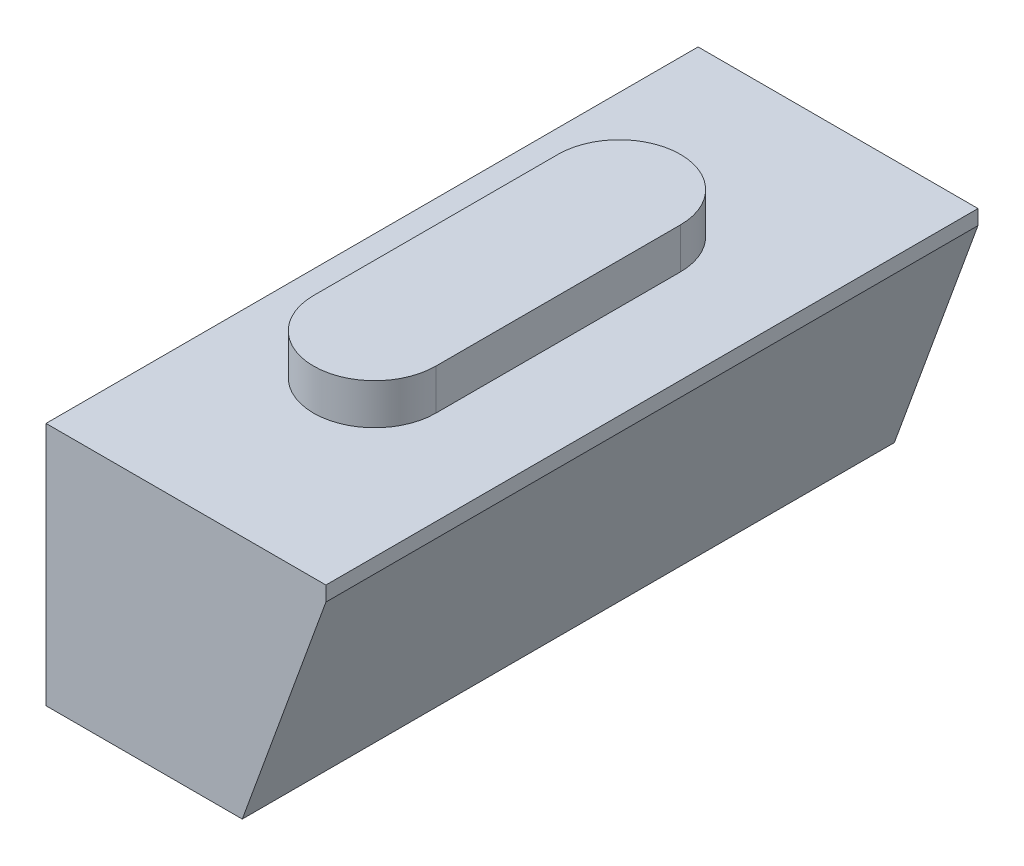
ISO-10303-21;
HEADER;
FILE_DESCRIPTION(('STEP AP214'),'2;1');
FILE_NAME('part.step','',(''),(''),'','','');
FILE_SCHEMA(('AUTOMOTIVE_DESIGN { 1 0 10303 214 1 1 1 1 }'));
ENDSEC;
DATA;
#1=APPLICATION_CONTEXT('core data for automotive mechanical design processes');
#2=APPLICATION_PROTOCOL_DEFINITION('international standard','automotive_design',2000,#1);
#3=PRODUCT_CONTEXT('',#1,'mechanical');
#4=PRODUCT('Part','Part','',(#3));
#5=PRODUCT_RELATED_PRODUCT_CATEGORY('part','',(#4));
#6=PRODUCT_DEFINITION_FORMATION('','',#4);
#7=PRODUCT_DEFINITION_CONTEXT('part definition',#1,'design');
#8=PRODUCT_DEFINITION('design','',#6,#7);
#9=PRODUCT_DEFINITION_SHAPE('','',#8);
#10=(LENGTH_UNIT() NAMED_UNIT(*) SI_UNIT(.MILLI.,.METRE.));
#11=(NAMED_UNIT(*) PLANE_ANGLE_UNIT() SI_UNIT($,.RADIAN.));
#12=(NAMED_UNIT(*) SI_UNIT($,.STERADIAN.) SOLID_ANGLE_UNIT());
#13=UNCERTAINTY_MEASURE_WITH_UNIT(LENGTH_MEASURE(1.E-05),#10,'distance_accuracy_value','');
#14=(GEOMETRIC_REPRESENTATION_CONTEXT(3) GLOBAL_UNCERTAINTY_ASSIGNED_CONTEXT((#13)) GLOBAL_UNIT_ASSIGNED_CONTEXT((#10,
#11,#12)) REPRESENTATION_CONTEXT('',''));
#15=CARTESIAN_POINT('',(0.,0.,0.));
#16=DIRECTION('',(0.,0.,1.));
#17=DIRECTION('',(1.,0.,0.));
#18=AXIS2_PLACEMENT_3D('',#15,#16,#17);
#19=CARTESIAN_POINT('',(0.,60.,160.));
#20=DIRECTION('',(0.,1.,0.));
#21=DIRECTION('',(0.,0.,1.));
#22=AXIS2_PLACEMENT_3D('',#19,#20,#21);
#23=PLANE('',#22);
#24=DIRECTION('',(0.,0.,1.));
#25=VECTOR('',#24,1.);
#26=CARTESIAN_POINT('',(68.68,60.,160.));
#27=LINE('',#26,#25);
#28=CARTESIAN_POINT('',(68.68,60.,0.));
#29=VERTEX_POINT('',#28);
#30=CARTESIAN_POINT('',(68.68,60.,160.));
#31=VERTEX_POINT('',#30);
#32=EDGE_CURVE('E101',#29,#31,#27,.T.);
#33=ORIENTED_EDGE('',*,*,#32,.F.);
#34=DIRECTION('',(1.,0.,0.));
#35=VECTOR('',#34,1.);
#36=CARTESIAN_POINT('',(0.,60.,0.));
#37=LINE('',#36,#35);
#38=CARTESIAN_POINT('',(0.,60.,0.));
#39=VERTEX_POINT('',#38);
#40=EDGE_CURVE('E137',#39,#29,#37,.T.);
#41=ORIENTED_EDGE('',*,*,#40,.F.);
#42=DIRECTION('',(0.,0.,-1.));
#43=VECTOR('',#42,1.);
#44=CARTESIAN_POINT('',(0.,60.,160.));
#45=LINE('',#44,#43);
#46=CARTESIAN_POINT('',(0.,60.,160.));
#47=VERTEX_POINT('',#46);
#48=EDGE_CURVE('E122',#47,#39,#45,.T.);
#49=ORIENTED_EDGE('',*,*,#48,.F.);
#50=DIRECTION('',(1.,0.,0.));
#51=VECTOR('',#50,1.);
#52=CARTESIAN_POINT('',(0.,60.,160.));
#53=LINE('',#52,#51);
#54=EDGE_CURVE('E116',#47,#31,#53,.T.);
#55=ORIENTED_EDGE('',*,*,#54,.T.);
#56=EDGE_LOOP('',(#33,#41,#49,#55));
#57=FACE_BOUND('',#56,.T.);
#58=DIRECTION('',(0.,0.,1.));
#59=VECTOR('',#58,1.);
#60=CARTESIAN_POINT('',(15.65,60.,50.));
#61=LINE('',#60,#59);
#62=CARTESIAN_POINT('',(15.65,60.,50.));
#63=VERTEX_POINT('',#62);
#64=CARTESIAN_POINT('',(15.65,60.,110.));
#65=VERTEX_POINT('',#64);
#66=EDGE_CURVE('E171',#63,#65,#61,.T.);
#67=ORIENTED_EDGE('',*,*,#66,.F.);
#68=CARTESIAN_POINT('',(30.65,60.,50.));
#69=DIRECTION('',(0.,1.,0.));
#70=DIRECTION('',(0.,0.,1.));
#71=AXIS2_PLACEMENT_3D('',#68,#69,#70);
#72=CIRCLE('',#71,15.);
#73=CARTESIAN_POINT('',(45.65,60.,50.));
#74=VERTEX_POINT('',#73);
#75=EDGE_CURVE('E109',#74,#63,#72,.T.);
#76=ORIENTED_EDGE('',*,*,#75,.F.);
#77=DIRECTION('',(0.,0.,-1.));
#78=VECTOR('',#77,1.);
#79=CARTESIAN_POINT('',(45.65,60.,50.));
#80=LINE('',#79,#78);
#81=CARTESIAN_POINT('',(45.65,60.,110.));
#82=VERTEX_POINT('',#81);
#83=EDGE_CURVE('E166',#82,#74,#80,.T.);
#84=ORIENTED_EDGE('',*,*,#83,.F.);
#85=CARTESIAN_POINT('',(30.65,60.,110.));
#86=DIRECTION('',(0.,1.,0.));
#87=DIRECTION('',(0.,0.,1.));
#88=AXIS2_PLACEMENT_3D('',#85,#86,#87);
#89=CIRCLE('',#88,15.);
#90=EDGE_CURVE('E169',#65,#82,#89,.T.);
#91=ORIENTED_EDGE('',*,*,#90,.F.);
#92=EDGE_LOOP('',(#67,#76,#84,#91));
#93=FACE_BOUND('',#92,.T.);
#94=ADVANCED_FACE('F32',(#57,#93),#23,.T.);
#95=CARTESIAN_POINT('',(0.,0.,160.));
#96=DIRECTION('',(0.,1.,0.));
#97=DIRECTION('',(0.,0.,1.));
#98=AXIS2_PLACEMENT_3D('',#95,#96,#97);
#99=PLANE('',#98);
#100=DIRECTION('',(1.,0.,0.));
#101=VECTOR('',#100,1.);
#102=CARTESIAN_POINT('',(0.,0.,0.));
#103=LINE('',#102,#101);
#104=CARTESIAN_POINT('',(0.,0.,0.));
#105=VERTEX_POINT('',#104);
#106=CARTESIAN_POINT('',(48.1617859440276,0.,0.));
#107=VERTEX_POINT('',#106);
#108=EDGE_CURVE('E131',#105,#107,#103,.T.);
#109=ORIENTED_EDGE('',*,*,#108,.T.);
#110=DIRECTION('',(0.,0.,-1.));
#111=VECTOR('',#110,1.);
#112=CARTESIAN_POINT('',(48.1617859440276,0.,160.));
#113=LINE('',#112,#111);
#114=CARTESIAN_POINT('',(48.1617859440276,0.,160.));
#115=VERTEX_POINT('',#114);
#116=EDGE_CURVE('E40',#115,#107,#113,.T.);
#117=ORIENTED_EDGE('',*,*,#116,.F.);
#118=DIRECTION('',(1.,0.,0.));
#119=VECTOR('',#118,1.);
#120=CARTESIAN_POINT('',(0.,0.,160.));
#121=LINE('',#120,#119);
#122=CARTESIAN_POINT('',(0.,0.,160.));
#123=VERTEX_POINT('',#122);
#124=EDGE_CURVE('E127',#123,#115,#121,.T.);
#125=ORIENTED_EDGE('',*,*,#124,.F.);
#126=DIRECTION('',(0.,0.,-1.));
#127=VECTOR('',#126,1.);
#128=CARTESIAN_POINT('',(0.,0.,160.));
#129=LINE('',#128,#127);
#130=EDGE_CURVE('E125',#123,#105,#129,.T.);
#131=ORIENTED_EDGE('',*,*,#130,.T.);
#132=EDGE_LOOP('',(#109,#117,#125,#131));
#133=FACE_BOUND('',#132,.T.);
#134=ADVANCED_FACE('F34',(#133),#99,.F.);
#135=CARTESIAN_POINT('',(70.,60.,160.));
#136=DIRECTION('',(0.939692620785907,-0.342020143325673,0.));
#137=DIRECTION('',(0.342020143325673,0.939692620785907,0.));
#138=AXIS2_PLACEMENT_3D('',#135,#136,#137);
#139=PLANE('',#138);
#140=DIRECTION('',(0.,0.,-1.));
#141=VECTOR('',#140,1.);
#142=CARTESIAN_POINT('',(68.68,56.3733298063199,160.));
#143=LINE('',#142,#141);
#144=CARTESIAN_POINT('',(68.68,56.3733298063199,160.));
#145=VERTEX_POINT('',#144);
#146=CARTESIAN_POINT('',(68.68,56.3733298063199,0.));
#147=VERTEX_POINT('',#146);
#148=EDGE_CURVE('E47',#145,#147,#143,.T.);
#149=ORIENTED_EDGE('',*,*,#148,.F.);
#150=DIRECTION('',(-0.342020143325673,-0.939692620785907,0.));
#151=VECTOR('',#150,1.);
#152=CARTESIAN_POINT('',(70.,60.,160.));
#153=LINE('',#152,#151);
#154=EDGE_CURVE('E119',#145,#115,#153,.T.);
#155=ORIENTED_EDGE('',*,*,#154,.T.);
#156=ORIENTED_EDGE('',*,*,#116,.T.);
#157=DIRECTION('',(-0.342020143325673,-0.939692620785907,0.));
#158=VECTOR('',#157,1.);
#159=CARTESIAN_POINT('',(70.,60.,0.));
#160=LINE('',#159,#158);
#161=EDGE_CURVE('E134',#147,#107,#160,.T.);
#162=ORIENTED_EDGE('',*,*,#161,.F.);
#163=EDGE_LOOP('',(#149,#155,#156,#162));
#164=FACE_BOUND('',#163,.T.);
#165=ADVANCED_FACE('F147',(#164),#139,.T.);
#166=CARTESIAN_POINT('',(0.,0.,160.));
#167=DIRECTION('',(-1.,0.,0.));
#168=DIRECTION('',(0.,0.,1.));
#169=AXIS2_PLACEMENT_3D('',#166,#167,#168);
#170=PLANE('',#169);
#171=DIRECTION('',(0.,1.,0.));
#172=VECTOR('',#171,1.);
#173=CARTESIAN_POINT('',(0.,0.,0.));
#174=LINE('',#173,#172);
#175=EDGE_CURVE('E139',#105,#39,#174,.T.);
#176=ORIENTED_EDGE('',*,*,#175,.F.);
#177=ORIENTED_EDGE('',*,*,#130,.F.);
#178=DIRECTION('',(0.,1.,0.));
#179=VECTOR('',#178,1.);
#180=CARTESIAN_POINT('',(0.,0.,160.));
#181=LINE('',#180,#179);
#182=EDGE_CURVE('E123',#123,#47,#181,.T.);
#183=ORIENTED_EDGE('',*,*,#182,.T.);
#184=ORIENTED_EDGE('',*,*,#48,.T.);
#185=EDGE_LOOP('',(#176,#177,#183,#184));
#186=FACE_BOUND('',#185,.T.);
#187=ADVANCED_FACE('F155',(#186),#170,.T.);
#188=CARTESIAN_POINT('',(0.,0.,160.));
#189=DIRECTION('',(0.,0.,1.));
#190=DIRECTION('',(1.,0.,0.));
#191=AXIS2_PLACEMENT_3D('',#188,#189,#190);
#192=PLANE('',#191);
#193=DIRECTION('',(0.,-1.,0.));
#194=VECTOR('',#193,1.);
#195=CARTESIAN_POINT('',(68.68,53.4140486774601,160.));
#196=LINE('',#195,#194);
#197=EDGE_CURVE('E104',#31,#145,#196,.T.);
#198=ORIENTED_EDGE('',*,*,#197,.F.);
#199=ORIENTED_EDGE('',*,*,#54,.F.);
#200=ORIENTED_EDGE('',*,*,#182,.F.);
#201=ORIENTED_EDGE('',*,*,#124,.T.);
#202=ORIENTED_EDGE('',*,*,#154,.F.);
#203=EDGE_LOOP('',(#198,#199,#200,#201,#202));
#204=FACE_BOUND('',#203,.T.);
#205=ADVANCED_FACE('F114',(#204),#192,.T.);
#206=CARTESIAN_POINT('',(0.,0.,0.));
#207=DIRECTION('',(0.,0.,1.));
#208=DIRECTION('',(1.,0.,0.));
#209=AXIS2_PLACEMENT_3D('',#206,#207,#208);
#210=PLANE('',#209);
#211=ORIENTED_EDGE('',*,*,#40,.T.);
#212=DIRECTION('',(0.,-1.,0.));
#213=VECTOR('',#212,1.);
#214=CARTESIAN_POINT('',(68.68,0.,0.));
#215=LINE('',#214,#213);
#216=EDGE_CURVE('E11',#29,#147,#215,.T.);
#217=ORIENTED_EDGE('',*,*,#216,.T.);
#218=ORIENTED_EDGE('',*,*,#161,.T.);
#219=ORIENTED_EDGE('',*,*,#108,.F.);
#220=ORIENTED_EDGE('',*,*,#175,.T.);
#221=EDGE_LOOP('',(#211,#217,#218,#219,#220));
#222=FACE_BOUND('',#221,.T.);
#223=ADVANCED_FACE('F153',(#222),#210,.F.);
#224=CARTESIAN_POINT('',(30.65,70.,50.));
#225=DIRECTION('',(0.,-1.,0.));
#226=DIRECTION('',(0.,0.,-1.));
#227=AXIS2_PLACEMENT_3D('',#224,#225,#226);
#228=CYLINDRICAL_SURFACE('',#227,15.);
#229=ORIENTED_EDGE('',*,*,#75,.T.);
#230=DIRECTION('',(0.,-1.,0.));
#231=VECTOR('',#230,1.);
#232=CARTESIAN_POINT('',(15.65,70.,50.));
#233=LINE('',#232,#231);
#234=CARTESIAN_POINT('',(15.65,70.,50.));
#235=VERTEX_POINT('',#234);
#236=EDGE_CURVE('E135',#235,#63,#233,.T.);
#237=ORIENTED_EDGE('',*,*,#236,.F.);
#238=CARTESIAN_POINT('',(30.65,70.,50.));
#239=DIRECTION('',(0.,1.,0.));
#240=DIRECTION('',(0.,0.,1.));
#241=AXIS2_PLACEMENT_3D('',#238,#239,#240);
#242=CIRCLE('',#241,15.);
#243=CARTESIAN_POINT('',(45.65,70.,50.));
#244=VERTEX_POINT('',#243);
#245=EDGE_CURVE('E168',#244,#235,#242,.T.);
#246=ORIENTED_EDGE('',*,*,#245,.F.);
#247=DIRECTION('',(0.,-1.,0.));
#248=VECTOR('',#247,1.);
#249=CARTESIAN_POINT('',(45.65,70.,50.));
#250=LINE('',#249,#248);
#251=EDGE_CURVE('E162',#244,#74,#250,.T.);
#252=ORIENTED_EDGE('',*,*,#251,.T.);
#253=EDGE_LOOP('',(#229,#237,#246,#252));
#254=FACE_BOUND('',#253,.T.);
#255=ADVANCED_FACE('F189',(#254),#228,.T.);
#256=CARTESIAN_POINT('',(15.65,70.,50.));
#257=DIRECTION('',(1.,0.,0.));
#258=DIRECTION('',(0.,0.,-1.));
#259=AXIS2_PLACEMENT_3D('',#256,#257,#258);
#260=PLANE('',#259);
#261=ORIENTED_EDGE('',*,*,#66,.T.);
#262=DIRECTION('',(0.,-1.,0.));
#263=VECTOR('',#262,1.);
#264=CARTESIAN_POINT('',(15.65,70.,110.));
#265=LINE('',#264,#263);
#266=CARTESIAN_POINT('',(15.65,70.,110.));
#267=VERTEX_POINT('',#266);
#268=EDGE_CURVE('E158',#267,#65,#265,.T.);
#269=ORIENTED_EDGE('',*,*,#268,.F.);
#270=DIRECTION('',(0.,0.,1.));
#271=VECTOR('',#270,1.);
#272=CARTESIAN_POINT('',(15.65,70.,50.));
#273=LINE('',#272,#271);
#274=EDGE_CURVE('E178',#235,#267,#273,.T.);
#275=ORIENTED_EDGE('',*,*,#274,.F.);
#276=ORIENTED_EDGE('',*,*,#236,.T.);
#277=EDGE_LOOP('',(#261,#269,#275,#276));
#278=FACE_BOUND('',#277,.T.);
#279=ADVANCED_FACE('F193',(#278),#260,.F.);
#280=CARTESIAN_POINT('',(30.65,70.,110.));
#281=DIRECTION('',(0.,-1.,0.));
#282=DIRECTION('',(0.,0.,-1.));
#283=AXIS2_PLACEMENT_3D('',#280,#281,#282);
#284=CYLINDRICAL_SURFACE('',#283,15.);
#285=ORIENTED_EDGE('',*,*,#90,.T.);
#286=DIRECTION('',(0.,-1.,0.));
#287=VECTOR('',#286,1.);
#288=CARTESIAN_POINT('',(45.65,70.,110.));
#289=LINE('',#288,#287);
#290=CARTESIAN_POINT('',(45.65,70.,110.));
#291=VERTEX_POINT('',#290);
#292=EDGE_CURVE('E54',#291,#82,#289,.T.);
#293=ORIENTED_EDGE('',*,*,#292,.F.);
#294=CARTESIAN_POINT('',(30.65,70.,110.));
#295=DIRECTION('',(0.,1.,0.));
#296=DIRECTION('',(0.,0.,1.));
#297=AXIS2_PLACEMENT_3D('',#294,#295,#296);
#298=CIRCLE('',#297,15.);
#299=EDGE_CURVE('E176',#267,#291,#298,.T.);
#300=ORIENTED_EDGE('',*,*,#299,.F.);
#301=ORIENTED_EDGE('',*,*,#268,.T.);
#302=EDGE_LOOP('',(#285,#293,#300,#301));
#303=FACE_BOUND('',#302,.T.);
#304=ADVANCED_FACE('F197',(#303),#284,.T.);
#305=CARTESIAN_POINT('',(45.65,70.,50.));
#306=DIRECTION('',(-1.,0.,0.));
#307=DIRECTION('',(0.,0.,1.));
#308=AXIS2_PLACEMENT_3D('',#305,#306,#307);
#309=PLANE('',#308);
#310=ORIENTED_EDGE('',*,*,#83,.T.);
#311=ORIENTED_EDGE('',*,*,#251,.F.);
#312=DIRECTION('',(0.,0.,-1.));
#313=VECTOR('',#312,1.);
#314=CARTESIAN_POINT('',(45.65,70.,50.));
#315=LINE('',#314,#313);
#316=EDGE_CURVE('E165',#291,#244,#315,.T.);
#317=ORIENTED_EDGE('',*,*,#316,.F.);
#318=ORIENTED_EDGE('',*,*,#292,.T.);
#319=EDGE_LOOP('',(#310,#311,#317,#318));
#320=FACE_BOUND('',#319,.T.);
#321=ADVANCED_FACE('F199',(#320),#309,.F.);
#322=CARTESIAN_POINT('',(30.65,70.,50.));
#323=DIRECTION('',(0.,1.,0.));
#324=DIRECTION('',(0.,0.,1.));
#325=AXIS2_PLACEMENT_3D('',#322,#323,#324);
#326=PLANE('',#325);
#327=ORIENTED_EDGE('',*,*,#245,.T.);
#328=ORIENTED_EDGE('',*,*,#274,.T.);
#329=ORIENTED_EDGE('',*,*,#299,.T.);
#330=ORIENTED_EDGE('',*,*,#316,.T.);
#331=EDGE_LOOP('',(#327,#328,#329,#330));
#332=FACE_BOUND('',#331,.T.);
#333=ADVANCED_FACE('F185',(#332),#326,.T.);
#334=CARTESIAN_POINT('',(68.68,53.4140486774601,-15.));
#335=DIRECTION('',(-1.,0.,0.));
#336=DIRECTION('',(0.,0.,1.));
#337=AXIS2_PLACEMENT_3D('',#334,#335,#336);
#338=PLANE('',#337);
#339=ORIENTED_EDGE('',*,*,#32,.T.);
#340=ORIENTED_EDGE('',*,*,#197,.T.);
#341=ORIENTED_EDGE('',*,*,#148,.T.);
#342=ORIENTED_EDGE('',*,*,#216,.F.);
#343=EDGE_LOOP('',(#339,#340,#341,#342));
#344=FACE_BOUND('',#343,.T.);
#345=ADVANCED_FACE('F103',(#344),#338,.F.);
#346=CLOSED_SHELL('',(#94,#134,#165,#187,#205,#223,#255,#279,#304,#321,#333,#345));
#347=MANIFOLD_SOLID_BREP('B2',#346);
#348=ADVANCED_BREP_SHAPE_REPRESENTATION('',(#18,#347),#14);
#349=SHAPE_DEFINITION_REPRESENTATION(#9,#348);
ENDSEC;
END-ISO-10303-21;
